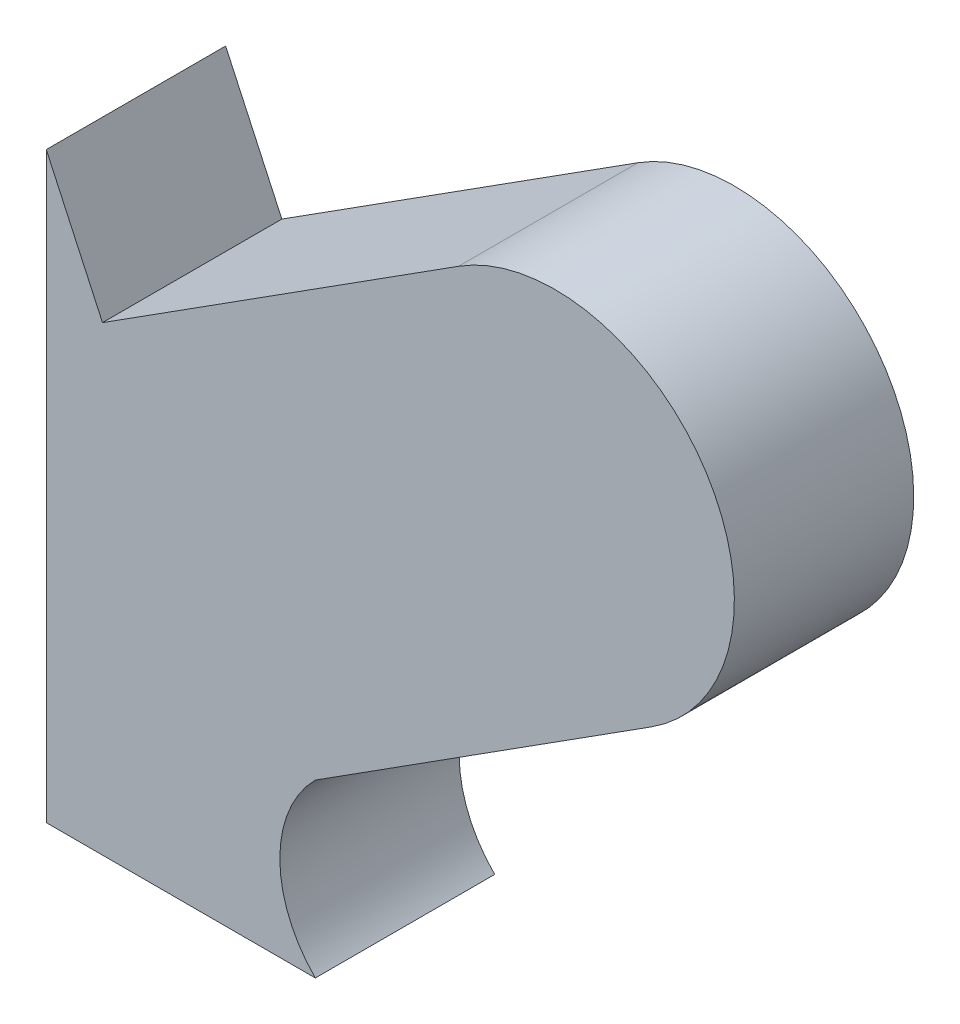
ISO-10303-21;
HEADER;
FILE_DESCRIPTION(('STEP AP214'),'2;1');
FILE_NAME('part.step','',(''),(''),'','','');
FILE_SCHEMA(('AUTOMOTIVE_DESIGN { 1 0 10303 214 1 1 1 1 }'));
ENDSEC;
DATA;
#1=APPLICATION_CONTEXT('core data for automotive mechanical design processes');
#2=APPLICATION_PROTOCOL_DEFINITION('international standard','automotive_design',2000,#1);
#3=PRODUCT_CONTEXT('',#1,'mechanical');
#4=PRODUCT('Part','Part','',(#3));
#5=PRODUCT_RELATED_PRODUCT_CATEGORY('part','',(#4));
#6=PRODUCT_DEFINITION_FORMATION('','',#4);
#7=PRODUCT_DEFINITION_CONTEXT('part definition',#1,'design');
#8=PRODUCT_DEFINITION('design','',#6,#7);
#9=PRODUCT_DEFINITION_SHAPE('','',#8);
#10=(LENGTH_UNIT() NAMED_UNIT(*) SI_UNIT(.MILLI.,.METRE.));
#11=(NAMED_UNIT(*) PLANE_ANGLE_UNIT() SI_UNIT($,.RADIAN.));
#12=(NAMED_UNIT(*) SI_UNIT($,.STERADIAN.) SOLID_ANGLE_UNIT());
#13=UNCERTAINTY_MEASURE_WITH_UNIT(LENGTH_MEASURE(1.E-05),#10,'distance_accuracy_value','');
#14=(GEOMETRIC_REPRESENTATION_CONTEXT(3) GLOBAL_UNCERTAINTY_ASSIGNED_CONTEXT((#13)) GLOBAL_UNIT_ASSIGNED_CONTEXT((#10,
#11,#12)) REPRESENTATION_CONTEXT('',''));
#15=CARTESIAN_POINT('',(0.,0.,0.));
#16=DIRECTION('',(0.,0.,1.));
#17=DIRECTION('',(1.,0.,0.));
#18=AXIS2_PLACEMENT_3D('',#15,#16,#17);
#19=CARTESIAN_POINT('',(0.,0.,10.));
#20=DIRECTION('',(0.,1.,0.));
#21=DIRECTION('',(0.,0.,1.));
#22=AXIS2_PLACEMENT_3D('',#19,#20,#21);
#23=PLANE('',#22);
#24=DIRECTION('',(1.,0.,0.));
#25=VECTOR('',#24,1.);
#26=CARTESIAN_POINT('',(0.,0.,0.));
#27=LINE('',#26,#25);
#28=CARTESIAN_POINT('',(0.,0.,0.));
#29=VERTEX_POINT('',#28);
#30=CARTESIAN_POINT('',(15.,0.,0.));
#31=VERTEX_POINT('',#30);
#32=EDGE_CURVE('E139',#29,#31,#27,.T.);
#33=ORIENTED_EDGE('',*,*,#32,.T.);
#34=DIRECTION('',(0.,0.,-1.));
#35=VECTOR('',#34,1.);
#36=CARTESIAN_POINT('',(15.,0.,10.));
#37=LINE('',#36,#35);
#38=CARTESIAN_POINT('',(15.,0.,10.));
#39=VERTEX_POINT('',#38);
#40=EDGE_CURVE('E11',#39,#31,#37,.T.);
#41=ORIENTED_EDGE('',*,*,#40,.F.);
#42=DIRECTION('',(1.,0.,0.));
#43=VECTOR('',#42,1.);
#44=CARTESIAN_POINT('',(0.,0.,10.));
#45=LINE('',#44,#43);
#46=CARTESIAN_POINT('',(0.,0.,10.));
#47=VERTEX_POINT('',#46);
#48=EDGE_CURVE('E159',#47,#39,#45,.T.);
#49=ORIENTED_EDGE('',*,*,#48,.F.);
#50=DIRECTION('',(0.,0.,-1.));
#51=VECTOR('',#50,1.);
#52=CARTESIAN_POINT('',(0.,0.,10.));
#53=LINE('',#52,#51);
#54=EDGE_CURVE('E136',#47,#29,#53,.T.);
#55=ORIENTED_EDGE('',*,*,#54,.T.);
#56=EDGE_LOOP('',(#33,#41,#49,#55));
#57=FACE_BOUND('',#56,.T.);
#58=ADVANCED_FACE('F44',(#57),#23,.F.);
#59=CARTESIAN_POINT('',(19.7780269560581,4.77802695605621,10.));
#60=DIRECTION('',(0.,0.,-1.));
#61=DIRECTION('',(-1.,0.,0.));
#62=AXIS2_PLACEMENT_3D('',#59,#60,#61);
#63=CYLINDRICAL_SURFACE('',#62,6.75715052264024);
#64=CARTESIAN_POINT('',(19.7780269560581,4.77802695605621,0.));
#65=DIRECTION('',(0.,0.,-1.));
#66=DIRECTION('',(-1.,0.,0.));
#67=AXIS2_PLACEMENT_3D('',#64,#65,#66);
#68=CIRCLE('',#67,6.75715052264024);
#69=CARTESIAN_POINT('',(15.,9.55605391211243,0.));
#70=VERTEX_POINT('',#69);
#71=EDGE_CURVE('E143',#31,#70,#68,.T.);
#72=ORIENTED_EDGE('',*,*,#71,.T.);
#73=DIRECTION('',(0.,0.,-1.));
#74=VECTOR('',#73,1.);
#75=CARTESIAN_POINT('',(15.,9.55605391211243,10.));
#76=LINE('',#75,#74);
#77=CARTESIAN_POINT('',(15.,9.55605391211243,10.));
#78=VERTEX_POINT('',#77);
#79=EDGE_CURVE('E53',#78,#70,#76,.T.);
#80=ORIENTED_EDGE('',*,*,#79,.F.);
#81=CARTESIAN_POINT('',(19.7780269560581,4.77802695605621,10.));
#82=DIRECTION('',(0.,0.,-1.));
#83=DIRECTION('',(-1.,0.,0.));
#84=AXIS2_PLACEMENT_3D('',#81,#82,#83);
#85=CIRCLE('',#84,6.75715052264024);
#86=EDGE_CURVE('E105',#39,#78,#85,.T.);
#87=ORIENTED_EDGE('',*,*,#86,.F.);
#88=ORIENTED_EDGE('',*,*,#40,.T.);
#89=EDGE_LOOP('',(#72,#80,#87,#88));
#90=FACE_BOUND('',#89,.T.);
#91=ADVANCED_FACE('F194',(#90),#63,.F.);
#92=CARTESIAN_POINT('',(15.,9.55605391211243,10.));
#93=DIRECTION('',(-0.537299608346825,0.843391445812885,0.));
#94=DIRECTION('',(-0.843391445812885,-0.537299608346825,0.));
#95=AXIS2_PLACEMENT_3D('',#92,#93,#94);
#96=PLANE('',#95);
#97=DIRECTION('',(0.843391445812885,0.537299608346825,0.));
#98=VECTOR('',#97,1.);
#99=CARTESIAN_POINT('',(15.,9.55605391211243,0.));
#100=LINE('',#99,#98);
#101=CARTESIAN_POINT('',(33.7356578325154,21.491984333873,0.));
#102=VERTEX_POINT('',#101);
#103=EDGE_CURVE('E150',#70,#102,#100,.T.);
#104=ORIENTED_EDGE('',*,*,#103,.T.);
#105=DIRECTION('',(0.,0.,-1.));
#106=VECTOR('',#105,1.);
#107=CARTESIAN_POINT('',(33.7356578325154,21.491984333873,10.));
#108=LINE('',#107,#106);
#109=CARTESIAN_POINT('',(33.7356578325154,21.491984333873,10.));
#110=VERTEX_POINT('',#109);
#111=EDGE_CURVE('E168',#110,#102,#108,.T.);
#112=ORIENTED_EDGE('',*,*,#111,.F.);
#113=DIRECTION('',(0.843391445812885,0.537299608346825,0.));
#114=VECTOR('',#113,1.);
#115=CARTESIAN_POINT('',(15.,9.55605391211243,10.));
#116=LINE('',#115,#114);
#117=EDGE_CURVE('E176',#78,#110,#116,.T.);
#118=ORIENTED_EDGE('',*,*,#117,.F.);
#119=ORIENTED_EDGE('',*,*,#79,.T.);
#120=EDGE_LOOP('',(#104,#112,#118,#119));
#121=FACE_BOUND('',#120,.T.);
#122=ADVANCED_FACE('F174',(#121),#96,.F.);
#123=CARTESIAN_POINT('',(28.3626617490471,29.9258987920018,10.));
#124=DIRECTION('',(0.,0.,-1.));
#125=DIRECTION('',(-1.,0.,0.));
#126=AXIS2_PLACEMENT_3D('',#123,#124,#125);
#127=CYLINDRICAL_SURFACE('',#126,10.);
#128=CARTESIAN_POINT('',(28.3626617490471,29.9258987920018,0.));
#129=DIRECTION('',(0.,0.,1.));
#130=DIRECTION('',(-1.,0.,0.));
#131=AXIS2_PLACEMENT_3D('',#128,#129,#130);
#132=CIRCLE('',#131,10.);
#133=CARTESIAN_POINT('',(22.9896656655788,38.3598132501307,0.));
#134=VERTEX_POINT('',#133);
#135=EDGE_CURVE('E148',#102,#134,#132,.T.);
#136=ORIENTED_EDGE('',*,*,#135,.T.);
#137=DIRECTION('',(0.,0.,-1.));
#138=VECTOR('',#137,1.);
#139=CARTESIAN_POINT('',(22.9896656655788,38.3598132501307,10.));
#140=LINE('',#139,#138);
#141=CARTESIAN_POINT('',(22.9896656655788,38.3598132501307,10.));
#142=VERTEX_POINT('',#141);
#143=EDGE_CURVE('E129',#142,#134,#140,.T.);
#144=ORIENTED_EDGE('',*,*,#143,.F.);
#145=CARTESIAN_POINT('',(28.3626617490471,29.9258987920018,10.));
#146=DIRECTION('',(0.,0.,1.));
#147=DIRECTION('',(-1.,0.,0.));
#148=AXIS2_PLACEMENT_3D('',#145,#146,#147);
#149=CIRCLE('',#148,10.);
#150=EDGE_CURVE('E120',#110,#142,#149,.T.);
#151=ORIENTED_EDGE('',*,*,#150,.F.);
#152=ORIENTED_EDGE('',*,*,#111,.T.);
#153=EDGE_LOOP('',(#136,#144,#151,#152));
#154=FACE_BOUND('',#153,.T.);
#155=ADVANCED_FACE('F185',(#154),#127,.T.);
#156=CARTESIAN_POINT('',(22.9896656655788,38.3598132501307,10.));
#157=DIRECTION('',(0.537299608346832,-0.843391445812881,0.));
#158=DIRECTION('',(0.843391445812881,0.537299608346832,0.));
#159=AXIS2_PLACEMENT_3D('',#156,#157,#158);
#160=PLANE('',#159);
#161=DIRECTION('',(-0.843391445812881,-0.537299608346832,0.));
#162=VECTOR('',#161,1.);
#163=CARTESIAN_POINT('',(22.9896656655788,38.3598132501307,0.));
#164=LINE('',#163,#162);
#165=CARTESIAN_POINT('',(3.13375301556281,25.7102017996139,0.));
#166=VERTEX_POINT('',#165);
#167=EDGE_CURVE('E130',#134,#166,#164,.T.);
#168=ORIENTED_EDGE('',*,*,#167,.T.);
#169=DIRECTION('',(0.,0.,-1.));
#170=VECTOR('',#169,1.);
#171=CARTESIAN_POINT('',(3.13375301556281,25.7102017996139,10.));
#172=LINE('',#171,#170);
#173=CARTESIAN_POINT('',(3.13375301556281,25.7102017996139,10.));
#174=VERTEX_POINT('',#173);
#175=EDGE_CURVE('E125',#174,#166,#172,.T.);
#176=ORIENTED_EDGE('',*,*,#175,.F.);
#177=DIRECTION('',(-0.843391445812881,-0.537299608346832,0.));
#178=VECTOR('',#177,1.);
#179=CARTESIAN_POINT('',(22.9896656655788,38.3598132501307,10.));
#180=LINE('',#179,#178);
#181=EDGE_CURVE('E115',#142,#174,#180,.T.);
#182=ORIENTED_EDGE('',*,*,#181,.F.);
#183=ORIENTED_EDGE('',*,*,#143,.T.);
#184=EDGE_LOOP('',(#168,#176,#182,#183));
#185=FACE_BOUND('',#184,.T.);
#186=ADVANCED_FACE('F124',(#185),#160,.F.);
#187=CARTESIAN_POINT('',(0.,32.5,10.));
#188=DIRECTION('',(-0.907959384500452,-0.419058177461747,0.));
#189=DIRECTION('',(0.419058177461747,-0.907959384500452,0.));
#190=AXIS2_PLACEMENT_3D('',#187,#188,#189);
#191=PLANE('',#190);
#192=DIRECTION('',(-0.419058177461747,0.907959384500452,0.));
#193=VECTOR('',#192,1.);
#194=CARTESIAN_POINT('',(0.,32.5,0.));
#195=LINE('',#194,#193);
#196=CARTESIAN_POINT('',(0.,32.5,0.));
#197=VERTEX_POINT('',#196);
#198=EDGE_CURVE('E88',#166,#197,#195,.T.);
#199=ORIENTED_EDGE('',*,*,#198,.T.);
#200=DIRECTION('',(0.,0.,-1.));
#201=VECTOR('',#200,1.);
#202=CARTESIAN_POINT('',(0.,32.5,10.));
#203=LINE('',#202,#201);
#204=CARTESIAN_POINT('',(0.,32.5,10.));
#205=VERTEX_POINT('',#204);
#206=EDGE_CURVE('E127',#205,#197,#203,.T.);
#207=ORIENTED_EDGE('',*,*,#206,.F.);
#208=DIRECTION('',(-0.419058177461747,0.907959384500452,0.));
#209=VECTOR('',#208,1.);
#210=CARTESIAN_POINT('',(0.,32.5,10.));
#211=LINE('',#210,#209);
#212=EDGE_CURVE('E117',#174,#205,#211,.T.);
#213=ORIENTED_EDGE('',*,*,#212,.F.);
#214=ORIENTED_EDGE('',*,*,#175,.T.);
#215=EDGE_LOOP('',(#199,#207,#213,#214));
#216=FACE_BOUND('',#215,.T.);
#217=ADVANCED_FACE('F135',(#216),#191,.F.);
#218=CARTESIAN_POINT('',(0.,0.,10.));
#219=DIRECTION('',(1.,0.,0.));
#220=DIRECTION('',(0.,0.,-1.));
#221=AXIS2_PLACEMENT_3D('',#218,#219,#220);
#222=PLANE('',#221);
#223=DIRECTION('',(0.,-1.,0.));
#224=VECTOR('',#223,1.);
#225=CARTESIAN_POINT('',(0.,0.,0.));
#226=LINE('',#225,#224);
#227=EDGE_CURVE('E92',#197,#29,#226,.T.);
#228=ORIENTED_EDGE('',*,*,#227,.T.);
#229=ORIENTED_EDGE('',*,*,#54,.F.);
#230=DIRECTION('',(0.,-1.,0.));
#231=VECTOR('',#230,1.);
#232=CARTESIAN_POINT('',(0.,0.,10.));
#233=LINE('',#232,#231);
#234=EDGE_CURVE('E64',#205,#47,#233,.T.);
#235=ORIENTED_EDGE('',*,*,#234,.F.);
#236=ORIENTED_EDGE('',*,*,#206,.T.);
#237=EDGE_LOOP('',(#228,#229,#235,#236));
#238=FACE_BOUND('',#237,.T.);
#239=ADVANCED_FACE('F209',(#238),#222,.F.);
#240=CARTESIAN_POINT('',(19.7780269560581,4.77802695605621,10.));
#241=DIRECTION('',(0.,0.,-1.));
#242=DIRECTION('',(-1.,0.,0.));
#243=AXIS2_PLACEMENT_3D('',#240,#241,#242);
#244=PLANE('',#243);
#245=ORIENTED_EDGE('',*,*,#48,.T.);
#246=ORIENTED_EDGE('',*,*,#86,.T.);
#247=ORIENTED_EDGE('',*,*,#117,.T.);
#248=ORIENTED_EDGE('',*,*,#150,.T.);
#249=ORIENTED_EDGE('',*,*,#181,.T.);
#250=ORIENTED_EDGE('',*,*,#212,.T.);
#251=ORIENTED_EDGE('',*,*,#234,.T.);
#252=EDGE_LOOP('',(#245,#246,#247,#248,#249,#250,#251));
#253=FACE_BOUND('',#252,.T.);
#254=ADVANCED_FACE('F114',(#253),#244,.F.);
#255=CARTESIAN_POINT('',(19.7780269560581,4.77802695605621,0.));
#256=DIRECTION('',(0.,0.,-1.));
#257=DIRECTION('',(-1.,0.,0.));
#258=AXIS2_PLACEMENT_3D('',#255,#256,#257);
#259=PLANE('',#258);
#260=ORIENTED_EDGE('',*,*,#32,.F.);
#261=ORIENTED_EDGE('',*,*,#227,.F.);
#262=ORIENTED_EDGE('',*,*,#198,.F.);
#263=ORIENTED_EDGE('',*,*,#167,.F.);
#264=ORIENTED_EDGE('',*,*,#135,.F.);
#265=ORIENTED_EDGE('',*,*,#103,.F.);
#266=ORIENTED_EDGE('',*,*,#71,.F.);
#267=EDGE_LOOP('',(#260,#261,#262,#263,#264,#265,#266));
#268=FACE_BOUND('',#267,.T.);
#269=ADVANCED_FACE('F179',(#268),#259,.T.);
#270=CLOSED_SHELL('',(#58,#91,#122,#155,#186,#217,#239,#254,#269));
#271=MANIFOLD_SOLID_BREP('B2',#270);
#272=ADVANCED_BREP_SHAPE_REPRESENTATION('',(#18,#271),#14);
#273=SHAPE_DEFINITION_REPRESENTATION(#9,#272);
ENDSEC;
END-ISO-10303-21;
